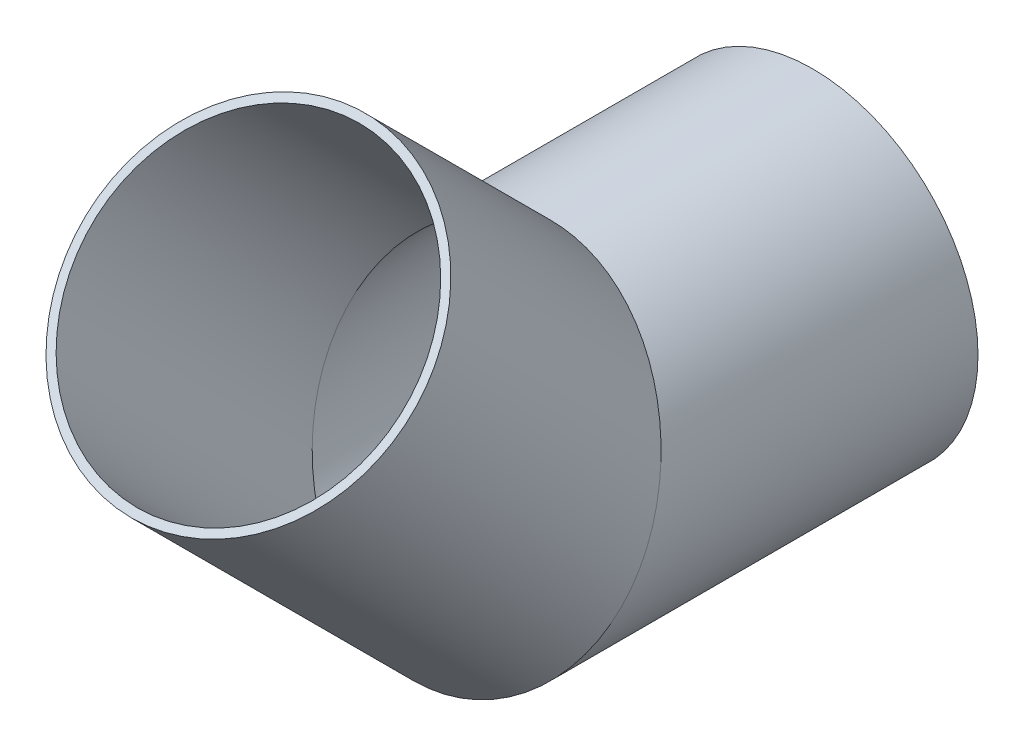
ISO-10303-21;
HEADER;
FILE_DESCRIPTION(('STEP AP214'),'2;1');
FILE_NAME('part.step','',(''),(''),'','','');
FILE_SCHEMA(('AUTOMOTIVE_DESIGN { 1 0 10303 214 1 1 1 1 }'));
ENDSEC;
DATA;
#1=APPLICATION_CONTEXT('core data for automotive mechanical design processes');
#2=APPLICATION_PROTOCOL_DEFINITION('international standard','automotive_design',2000,#1);
#3=PRODUCT_CONTEXT('',#1,'mechanical');
#4=PRODUCT('Part','Part','',(#3));
#5=PRODUCT_RELATED_PRODUCT_CATEGORY('part','',(#4));
#6=PRODUCT_DEFINITION_FORMATION('','',#4);
#7=PRODUCT_DEFINITION_CONTEXT('part definition',#1,'design');
#8=PRODUCT_DEFINITION('design','',#6,#7);
#9=PRODUCT_DEFINITION_SHAPE('','',#8);
#10=(LENGTH_UNIT() NAMED_UNIT(*) SI_UNIT(.MILLI.,.METRE.));
#11=(NAMED_UNIT(*) PLANE_ANGLE_UNIT() SI_UNIT($,.RADIAN.));
#12=(NAMED_UNIT(*) SI_UNIT($,.STERADIAN.) SOLID_ANGLE_UNIT());
#13=UNCERTAINTY_MEASURE_WITH_UNIT(LENGTH_MEASURE(1.E-05),#10,'distance_accuracy_value','');
#14=(GEOMETRIC_REPRESENTATION_CONTEXT(3) GLOBAL_UNCERTAINTY_ASSIGNED_CONTEXT((#13)) GLOBAL_UNIT_ASSIGNED_CONTEXT((#10,
#11,#12)) REPRESENTATION_CONTEXT('',''));
#15=CARTESIAN_POINT('',(0.,0.,0.));
#16=DIRECTION('',(0.,0.,1.));
#17=DIRECTION('',(1.,0.,0.));
#18=AXIS2_PLACEMENT_3D('',#15,#16,#17);
#19=CARTESIAN_POINT('',(0.,-70.7106781186545,129.289321881345));
#20=DIRECTION('',(0.,0.707106781186546,0.707106781186549));
#21=DIRECTION('',(0.,-0.707106781186549,0.707106781186546));
#22=AXIS2_PLACEMENT_3D('',#19,#20,#21);
#23=CYLINDRICAL_SURFACE('',#22,100.);
#24=CARTESIAN_POINT('',(0.,0.,200.));
#25=DIRECTION('',(0.,0.382683432365089,0.923879532511287));
#26=DIRECTION('',(0.,0.923879532511287,-0.382683432365089));
#27=AXIS2_PLACEMENT_3D('',#24,#25,#26);
#28=ELLIPSE('',#27,108.239220029239,100.);
#29=CARTESIAN_POINT('',(0.,100.,158.578643762691));
#30=VERTEX_POINT('',#29);
#31=EDGE_CURVE('E53',#30,#30,#28,.F.);
#32=ORIENTED_EDGE('',*,*,#31,.F.);
#33=EDGE_LOOP('',(#32));
#34=FACE_BOUND('',#33,.T.);
#35=CARTESIAN_POINT('',(0.,141.421356237309,341.42135623731));
#36=DIRECTION('',(0.,0.707106781186546,0.707106781186549));
#37=DIRECTION('',(0.,-0.707106781186549,0.707106781186546));
#38=AXIS2_PLACEMENT_3D('',#35,#36,#37);
#39=CIRCLE('',#38,100.);
#40=CARTESIAN_POINT('',(0.,70.7106781186542,412.132034355964));
#41=VERTEX_POINT('',#40);
#42=EDGE_CURVE('E44',#41,#41,#39,.T.);
#43=ORIENTED_EDGE('',*,*,#42,.F.);
#44=EDGE_LOOP('',(#43));
#45=FACE_BOUND('',#44,.T.);
#46=ADVANCED_FACE('F40',(#34,#45),#23,.T.);
#47=CARTESIAN_POINT('',(0.,-70.7106781186545,129.289321881345));
#48=DIRECTION('',(0.,0.707106781186546,0.707106781186549));
#49=DIRECTION('',(0.,-0.707106781186549,0.707106781186546));
#50=AXIS2_PLACEMENT_3D('',#47,#48,#49);
#51=CYLINDRICAL_SURFACE('',#50,95.);
#52=CARTESIAN_POINT('',(0.,141.421356237309,341.42135623731));
#53=DIRECTION('',(0.,0.707106781186546,0.707106781186549));
#54=DIRECTION('',(0.,-0.707106781186549,0.707106781186546));
#55=AXIS2_PLACEMENT_3D('',#52,#53,#54);
#56=CIRCLE('',#55,95.);
#57=CARTESIAN_POINT('',(0.,74.246212024587,408.596500450032));
#58=VERTEX_POINT('',#57);
#59=EDGE_CURVE('E10',#58,#58,#56,.T.);
#60=ORIENTED_EDGE('',*,*,#59,.T.);
#61=EDGE_LOOP('',(#60));
#62=FACE_BOUND('',#61,.T.);
#63=CARTESIAN_POINT('',(0.,0.,200.));
#64=DIRECTION('',(0.,0.382683432365089,0.923879532511287));
#65=DIRECTION('',(0.,0.923879532511287,-0.382683432365089));
#66=AXIS2_PLACEMENT_3D('',#63,#64,#65);
#67=ELLIPSE('',#66,102.827259027777,95.);
#68=CARTESIAN_POINT('',(0.,95.,160.649711574556));
#69=VERTEX_POINT('',#68);
#70=EDGE_CURVE('E56',#69,#69,#67,.T.);
#71=ORIENTED_EDGE('',*,*,#70,.F.);
#72=EDGE_LOOP('',(#71));
#73=FACE_BOUND('',#72,.T.);
#74=ADVANCED_FACE('F80',(#62,#73),#51,.F.);
#75=CARTESIAN_POINT('',(0.,141.421356237309,341.42135623731));
#76=DIRECTION('',(0.,0.707106781186546,0.707106781186549));
#77=DIRECTION('',(0.,-0.707106781186549,0.707106781186546));
#78=AXIS2_PLACEMENT_3D('',#75,#76,#77);
#79=PLANE('',#78);
#80=ORIENTED_EDGE('',*,*,#42,.T.);
#81=EDGE_LOOP('',(#80));
#82=FACE_BOUND('',#81,.T.);
#83=ORIENTED_EDGE('',*,*,#59,.F.);
#84=EDGE_LOOP('',(#83));
#85=FACE_BOUND('',#84,.T.);
#86=ADVANCED_FACE('F42',(#82,#85),#79,.T.);
#87=CARTESIAN_POINT('',(0.,0.,0.));
#88=DIRECTION('',(0.,0.,1.));
#89=DIRECTION('',(1.,0.,0.));
#90=AXIS2_PLACEMENT_3D('',#87,#88,#89);
#91=PLANE('',#90);
#92=CARTESIAN_POINT('',(0.,0.,0.));
#93=DIRECTION('',(0.,0.,1.));
#94=DIRECTION('',(1.,0.,0.));
#95=AXIS2_PLACEMENT_3D('',#92,#93,#94);
#96=CIRCLE('',#95,100.);
#97=CARTESIAN_POINT('',(100.,0.,0.));
#98=VERTEX_POINT('',#97);
#99=EDGE_CURVE('E59',#98,#98,#96,.T.);
#100=ORIENTED_EDGE('',*,*,#99,.F.);
#101=EDGE_LOOP('',(#100));
#102=FACE_BOUND('',#101,.T.);
#103=CARTESIAN_POINT('',(0.,0.,0.));
#104=DIRECTION('',(0.,0.,1.));
#105=DIRECTION('',(1.,0.,0.));
#106=AXIS2_PLACEMENT_3D('',#103,#104,#105);
#107=CIRCLE('',#106,95.);
#108=CARTESIAN_POINT('',(95.,0.,0.));
#109=VERTEX_POINT('',#108);
#110=EDGE_CURVE('E51',#109,#109,#107,.T.);
#111=ORIENTED_EDGE('',*,*,#110,.T.);
#112=EDGE_LOOP('',(#111));
#113=FACE_BOUND('',#112,.T.);
#114=ADVANCED_FACE('F68',(#102,#113),#91,.F.);
#115=CARTESIAN_POINT('',(0.,0.,400.));
#116=DIRECTION('',(0.,0.,-1.));
#117=DIRECTION('',(-1.,0.,0.));
#118=AXIS2_PLACEMENT_3D('',#115,#116,#117);
#119=CYLINDRICAL_SURFACE('',#118,100.);
#120=ORIENTED_EDGE('',*,*,#99,.T.);
#121=EDGE_LOOP('',(#120));
#122=FACE_BOUND('',#121,.T.);
#123=ORIENTED_EDGE('',*,*,#31,.T.);
#124=EDGE_LOOP('',(#123));
#125=FACE_BOUND('',#124,.T.);
#126=ADVANCED_FACE('F65',(#122,#125),#119,.T.);
#127=CARTESIAN_POINT('',(0.,0.,400.));
#128=DIRECTION('',(0.,0.,-1.));
#129=DIRECTION('',(-1.,0.,0.));
#130=AXIS2_PLACEMENT_3D('',#127,#128,#129);
#131=CYLINDRICAL_SURFACE('',#130,95.);
#132=ORIENTED_EDGE('',*,*,#110,.F.);
#133=EDGE_LOOP('',(#132));
#134=FACE_BOUND('',#133,.T.);
#135=ORIENTED_EDGE('',*,*,#70,.T.);
#136=EDGE_LOOP('',(#135));
#137=FACE_BOUND('',#136,.T.);
#138=ADVANCED_FACE('F74',(#134,#137),#131,.F.);
#139=CLOSED_SHELL('',(#46,#74,#86,#114,#126,#138));
#140=MANIFOLD_SOLID_BREP('B2',#139);
#141=ADVANCED_BREP_SHAPE_REPRESENTATION('',(#18,#140),#14);
#142=SHAPE_DEFINITION_REPRESENTATION(#9,#141);
ENDSEC;
END-ISO-10303-21;
